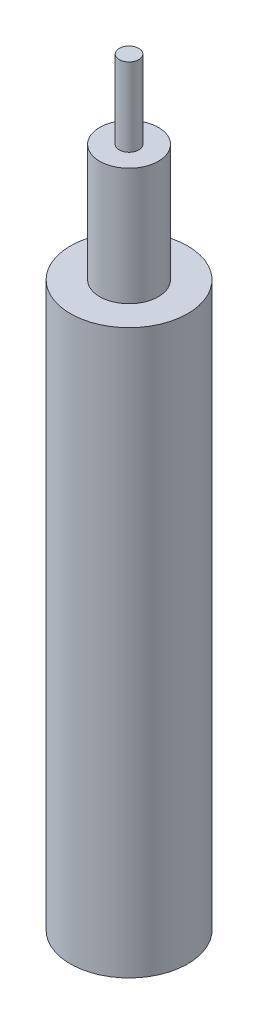
ISO-10303-21;
HEADER;
FILE_DESCRIPTION(('STEP AP214'),'2;1');
FILE_NAME('part.step','',(''),(''),'','','');
FILE_SCHEMA(('AUTOMOTIVE_DESIGN { 1 0 10303 214 1 1 1 1 }'));
ENDSEC;
DATA;
#1=APPLICATION_CONTEXT('core data for automotive mechanical design processes');
#2=APPLICATION_PROTOCOL_DEFINITION('international standard','automotive_design',2000,#1);
#3=PRODUCT_CONTEXT('',#1,'mechanical');
#4=PRODUCT('Part','Part','',(#3));
#5=PRODUCT_RELATED_PRODUCT_CATEGORY('part','',(#4));
#6=PRODUCT_DEFINITION_FORMATION('','',#4);
#7=PRODUCT_DEFINITION_CONTEXT('part definition',#1,'design');
#8=PRODUCT_DEFINITION('design','',#6,#7);
#9=PRODUCT_DEFINITION_SHAPE('','',#8);
#10=(LENGTH_UNIT() NAMED_UNIT(*) SI_UNIT(.MILLI.,.METRE.));
#11=(NAMED_UNIT(*) PLANE_ANGLE_UNIT() SI_UNIT($,.RADIAN.));
#12=(NAMED_UNIT(*) SI_UNIT($,.STERADIAN.) SOLID_ANGLE_UNIT());
#13=UNCERTAINTY_MEASURE_WITH_UNIT(LENGTH_MEASURE(1.E-05),#10,'distance_accuracy_value','');
#14=(GEOMETRIC_REPRESENTATION_CONTEXT(3) GLOBAL_UNCERTAINTY_ASSIGNED_CONTEXT((#13)) GLOBAL_UNIT_ASSIGNED_CONTEXT((#10,
#11,#12)) REPRESENTATION_CONTEXT('',''));
#15=CARTESIAN_POINT('',(0.,0.,0.));
#16=DIRECTION('',(0.,0.,1.));
#17=DIRECTION('',(1.,0.,0.));
#18=AXIS2_PLACEMENT_3D('',#15,#16,#17);
#19=CARTESIAN_POINT('',(0.,-9.525,0.));
#20=DIRECTION('',(0.,1.,0.));
#21=DIRECTION('',(0.,0.,1.));
#22=AXIS2_PLACEMENT_3D('',#19,#20,#21);
#23=CYLINDRICAL_SURFACE('',#22,2.38125);
#24=CARTESIAN_POINT('',(0.,-9.525,0.));
#25=DIRECTION('',(0.,1.,0.));
#26=DIRECTION('',(0.,0.,1.));
#27=AXIS2_PLACEMENT_3D('',#24,#25,#26);
#28=CIRCLE('',#27,2.38125);
#29=CARTESIAN_POINT('',(0.,-9.525,2.38125));
#30=VERTEX_POINT('',#29);
#31=EDGE_CURVE('E42',#30,#30,#28,.T.);
#32=CARTESIAN_POINT('',(0.,0.,0.));
#33=DIRECTION('',(0.,1.,0.));
#34=DIRECTION('',(0.,0.,1.));
#35=AXIS2_PLACEMENT_3D('',#32,#33,#34);
#36=CIRCLE('',#35,2.38125);
#37=CARTESIAN_POINT('',(0.,0.,2.38125));
#38=VERTEX_POINT('',#37);
#39=EDGE_CURVE('E34',#38,#38,#36,.T.);
#40=CARTESIAN_POINT('',(0.,-9.525,2.38125));
#41=CARTESIAN_POINT('',(0.,-9.42578125,2.38125));
#42=CARTESIAN_POINT('',(0.,-9.3265625,2.38125));
#43=CARTESIAN_POINT('',(0.,-9.128125,2.38125));
#44=CARTESIAN_POINT('',(0.,-9.02890625,2.38125));
#45=CARTESIAN_POINT('',(0.,-8.83046875,2.38125));
#46=CARTESIAN_POINT('',(0.,-8.73125,2.38125));
#47=CARTESIAN_POINT('',(0.,-8.5328125,2.38125));
#48=CARTESIAN_POINT('',(0.,-8.43359375,2.38125));
#49=CARTESIAN_POINT('',(0.,-8.23515625,2.38125));
#50=CARTESIAN_POINT('',(0.,-8.1359375,2.38125));
#51=CARTESIAN_POINT('',(0.,-7.9375,2.38125));
#52=CARTESIAN_POINT('',(0.,-7.83828125,2.38125));
#53=CARTESIAN_POINT('',(0.,-7.63984375,2.38125));
#54=CARTESIAN_POINT('',(0.,-7.540625,2.38125));
#55=CARTESIAN_POINT('',(0.,-7.3421875,2.38125));
#56=CARTESIAN_POINT('',(0.,-7.24296875,2.38125));
#57=CARTESIAN_POINT('',(0.,-7.04453125,2.38125));
#58=CARTESIAN_POINT('',(0.,-6.9453125,2.38125));
#59=CARTESIAN_POINT('',(0.,-6.746875,2.38125));
#60=CARTESIAN_POINT('',(0.,-6.64765625,2.38125));
#61=CARTESIAN_POINT('',(0.,-6.44921875,2.38125));
#62=CARTESIAN_POINT('',(0.,-6.35,2.38125));
#63=CARTESIAN_POINT('',(0.,-6.1515625,2.38125));
#64=CARTESIAN_POINT('',(0.,-6.05234375,2.38125));
#65=CARTESIAN_POINT('',(0.,-5.85390625,2.38125));
#66=CARTESIAN_POINT('',(0.,-5.7546875,2.38125));
#67=CARTESIAN_POINT('',(0.,-5.55625,2.38125));
#68=CARTESIAN_POINT('',(0.,-5.45703125,2.38125));
#69=CARTESIAN_POINT('',(0.,-5.25859375,2.38125));
#70=CARTESIAN_POINT('',(0.,-5.159375,2.38125));
#71=CARTESIAN_POINT('',(0.,-4.9609375,2.38125));
#72=CARTESIAN_POINT('',(0.,-4.86171875,2.38125));
#73=CARTESIAN_POINT('',(0.,-4.66328125,2.38125));
#74=CARTESIAN_POINT('',(0.,-4.5640625,2.38125));
#75=CARTESIAN_POINT('',(0.,-4.365625,2.38125));
#76=CARTESIAN_POINT('',(0.,-4.26640625,2.38125));
#77=CARTESIAN_POINT('',(0.,-4.06796875,2.38125));
#78=CARTESIAN_POINT('',(0.,-3.96875,2.38125));
#79=CARTESIAN_POINT('',(0.,-3.7703125,2.38125));
#80=CARTESIAN_POINT('',(0.,-3.67109375,2.38125));
#81=CARTESIAN_POINT('',(0.,-3.47265625,2.38125));
#82=CARTESIAN_POINT('',(0.,-3.3734375,2.38125));
#83=CARTESIAN_POINT('',(0.,-3.175,2.38125));
#84=CARTESIAN_POINT('',(0.,-3.07578125,2.38125));
#85=CARTESIAN_POINT('',(0.,-2.87734375,2.38125));
#86=CARTESIAN_POINT('',(0.,-2.778125,2.38125));
#87=CARTESIAN_POINT('',(0.,-2.5796875,2.38125));
#88=CARTESIAN_POINT('',(0.,-2.48046875,2.38125));
#89=CARTESIAN_POINT('',(0.,-2.28203125,2.38125));
#90=CARTESIAN_POINT('',(0.,-2.1828125,2.38125));
#91=CARTESIAN_POINT('',(0.,-1.984375,2.38125));
#92=CARTESIAN_POINT('',(0.,-1.88515625,2.38125));
#93=CARTESIAN_POINT('',(0.,-1.68671875,2.38125));
#94=CARTESIAN_POINT('',(0.,-1.5875,2.38125));
#95=CARTESIAN_POINT('',(0.,-1.3890625,2.38125));
#96=CARTESIAN_POINT('',(0.,-1.28984375,2.38125));
#97=CARTESIAN_POINT('',(0.,-1.09140625,2.38125));
#98=CARTESIAN_POINT('',(0.,-0.992187500000001,2.38125));
#99=CARTESIAN_POINT('',(0.,-0.793750000000001,2.38125));
#100=CARTESIAN_POINT('',(0.,-0.69453125,2.38125));
#101=CARTESIAN_POINT('',(0.,-0.49609375,2.38125));
#102=CARTESIAN_POINT('',(0.,-0.396875,2.38125));
#103=CARTESIAN_POINT('',(0.,-0.1984375,2.38125));
#104=CARTESIAN_POINT('',(0.,-0.0992187500000001,2.38125));
#105=CARTESIAN_POINT('',(0.,0.,2.38125));
#106=B_SPLINE_CURVE_WITH_KNOTS('',3,(#40,#41,#42,#43,#44,#45,#46,#47,#48,#49,#50,#51,#52,#53,
#54,#55,#56,#57,#58,#59,#60,#61,#62,#63,#64,#65,#66,#67,#68,#69,#70,#71,#72,#73,#74,#75,#76,#77,
#78,#79,#80,#81,#82,#83,#84,#85,#86,#87,#88,#89,#90,#91,#92,#93,#94,#95,#96,#97,#98,#99,#100,
#101,#102,#103,#104,#105),.UNSPECIFIED.,.F.,.F.,(4,2,2,2,2,2,2,2,2,2,2,2,2,2,2,2,2,2,2,2,2,2,2,
2,2,2,2,2,2,2,2,2,4),(0.,0.297656249999998,0.595312499999999,0.892968749999999,1.190625,
1.48828125,1.7859375,2.08359375,2.38125,2.67890625,2.9765625,3.27421875,3.571875,3.86953125,
4.1671875,4.46484375,4.7625,5.06015625,5.3578125,5.65546875,5.953125,6.25078125,6.5484375,
6.84609375,7.14375,7.44140625,7.7390625,8.03671875,8.334375,8.63203125,8.9296875,9.22734375,
9.525),.UNSPECIFIED.);
#107=EDGE_CURVE('BSEAM31',#30,#38,#106,.T.);
#108=ORIENTED_EDGE('',*,*,#31,.T.);
#109=ORIENTED_EDGE('',*,*,#39,.F.);
#110=ORIENTED_EDGE('',*,*,#107,.T.);
#111=ORIENTED_EDGE('',*,*,#107,.F.);
#112=EDGE_LOOP('',(#108,#110,#109,#111));
#113=FACE_BOUND('',#112,.T.);
#114=ADVANCED_FACE('F31',(#113),#23,.T.);
#115=CARTESIAN_POINT('',(0.,0.,0.));
#116=DIRECTION('',(0.,1.,0.));
#117=DIRECTION('',(0.,0.,1.));
#118=AXIS2_PLACEMENT_3D('',#115,#116,#117);
#119=PLANE('',#118);
#120=CARTESIAN_POINT('',(0.,0.,0.));
#121=DIRECTION('',(0.,1.,0.));
#122=DIRECTION('',(0.,0.,1.));
#123=AXIS2_PLACEMENT_3D('',#120,#121,#122);
#124=CIRCLE('',#123,0.79375);
#125=CARTESIAN_POINT('',(0.,0.,0.79375));
#126=VERTEX_POINT('',#125);
#127=EDGE_CURVE('E10',#126,#126,#124,.T.);
#128=ORIENTED_EDGE('',*,*,#127,.F.);
#129=EDGE_LOOP('',(#128));
#130=FACE_BOUND('',#129,.T.);
#131=ORIENTED_EDGE('',*,*,#39,.T.);
#132=EDGE_LOOP('',(#131));
#133=FACE_BOUND('',#132,.T.);
#134=ADVANCED_FACE('F66',(#130,#133),#119,.T.);
#135=CARTESIAN_POINT('',(0.,-55.245,0.));
#136=DIRECTION('',(0.,1.,0.));
#137=DIRECTION('',(0.,0.,1.));
#138=AXIS2_PLACEMENT_3D('',#135,#136,#137);
#139=CYLINDRICAL_SURFACE('',#138,4.7625);
#140=CARTESIAN_POINT('',(0.,-55.245,0.));
#141=DIRECTION('',(0.,-1.,0.));
#142=DIRECTION('',(0.,0.,-1.));
#143=AXIS2_PLACEMENT_3D('',#140,#141,#142);
#144=CIRCLE('',#143,4.7625);
#145=CARTESIAN_POINT('',(0.,-55.245,-4.7625));
#146=VERTEX_POINT('',#145);
#147=EDGE_CURVE('E46',#146,#146,#144,.T.);
#148=ORIENTED_EDGE('',*,*,#147,.F.);
#149=EDGE_LOOP('',(#148));
#150=FACE_BOUND('',#149,.T.);
#151=CARTESIAN_POINT('',(0.,-9.525,0.));
#152=DIRECTION('',(0.,-1.,0.));
#153=DIRECTION('',(0.,0.,-1.));
#154=AXIS2_PLACEMENT_3D('',#151,#152,#153);
#155=CIRCLE('',#154,4.7625);
#156=CARTESIAN_POINT('',(0.,-9.525,-4.7625));
#157=VERTEX_POINT('',#156);
#158=EDGE_CURVE('E49',#157,#157,#155,.T.);
#159=ORIENTED_EDGE('',*,*,#158,.T.);
#160=EDGE_LOOP('',(#159));
#161=FACE_BOUND('',#160,.T.);
#162=ADVANCED_FACE('F64',(#150,#161),#139,.T.);
#163=CARTESIAN_POINT('',(0.,-55.245,0.));
#164=DIRECTION('',(0.,-1.,0.));
#165=DIRECTION('',(0.,0.,-1.));
#166=AXIS2_PLACEMENT_3D('',#163,#164,#165);
#167=PLANE('',#166);
#168=ORIENTED_EDGE('',*,*,#147,.T.);
#169=EDGE_LOOP('',(#168));
#170=FACE_BOUND('',#169,.T.);
#171=ADVANCED_FACE('F60',(#170),#167,.T.);
#172=CARTESIAN_POINT('',(0.,-9.525,0.));
#173=DIRECTION('',(0.,-1.,0.));
#174=DIRECTION('',(0.,0.,-1.));
#175=AXIS2_PLACEMENT_3D('',#172,#173,#174);
#176=PLANE('',#175);
#177=ORIENTED_EDGE('',*,*,#31,.F.);
#178=EDGE_LOOP('',(#177));
#179=FACE_BOUND('',#178,.T.);
#180=ORIENTED_EDGE('',*,*,#158,.F.);
#181=EDGE_LOOP('',(#180));
#182=FACE_BOUND('',#181,.T.);
#183=ADVANCED_FACE('F56',(#179,#182),#176,.F.);
#184=CARTESIAN_POINT('',(0.,6.35,0.));
#185=DIRECTION('',(0.,-1.,0.));
#186=DIRECTION('',(0.,0.,-1.));
#187=AXIS2_PLACEMENT_3D('',#184,#185,#186);
#188=CYLINDRICAL_SURFACE('',#187,0.79375);
#189=CARTESIAN_POINT('',(0.,6.35,0.));
#190=DIRECTION('',(0.,1.,0.));
#191=DIRECTION('',(0.,0.,1.));
#192=AXIS2_PLACEMENT_3D('',#189,#190,#191);
#193=CIRCLE('',#192,0.79375);
#194=CARTESIAN_POINT('',(0.,6.35,0.79375));
#195=VERTEX_POINT('',#194);
#196=EDGE_CURVE('E45',#195,#195,#193,.T.);
#197=ORIENTED_EDGE('',*,*,#196,.F.);
#198=EDGE_LOOP('',(#197));
#199=FACE_BOUND('',#198,.T.);
#200=ORIENTED_EDGE('',*,*,#127,.T.);
#201=EDGE_LOOP('',(#200));
#202=FACE_BOUND('',#201,.T.);
#203=ADVANCED_FACE('F59',(#199,#202),#188,.T.);
#204=CARTESIAN_POINT('',(0.,6.35,0.));
#205=DIRECTION('',(0.,1.,0.));
#206=DIRECTION('',(0.,0.,1.));
#207=AXIS2_PLACEMENT_3D('',#204,#205,#206);
#208=PLANE('',#207);
#209=ORIENTED_EDGE('',*,*,#196,.T.);
#210=EDGE_LOOP('',(#209));
#211=FACE_BOUND('',#210,.T.);
#212=ADVANCED_FACE('F98',(#211),#208,.T.);
#213=CLOSED_SHELL('',(#114,#134,#162,#171,#183,#203,#212));
#214=MANIFOLD_SOLID_BREP('B2',#213);
#215=ADVANCED_BREP_SHAPE_REPRESENTATION('',(#18,#214),#14);
#216=SHAPE_DEFINITION_REPRESENTATION(#9,#215);
ENDSEC;
END-ISO-10303-21;
